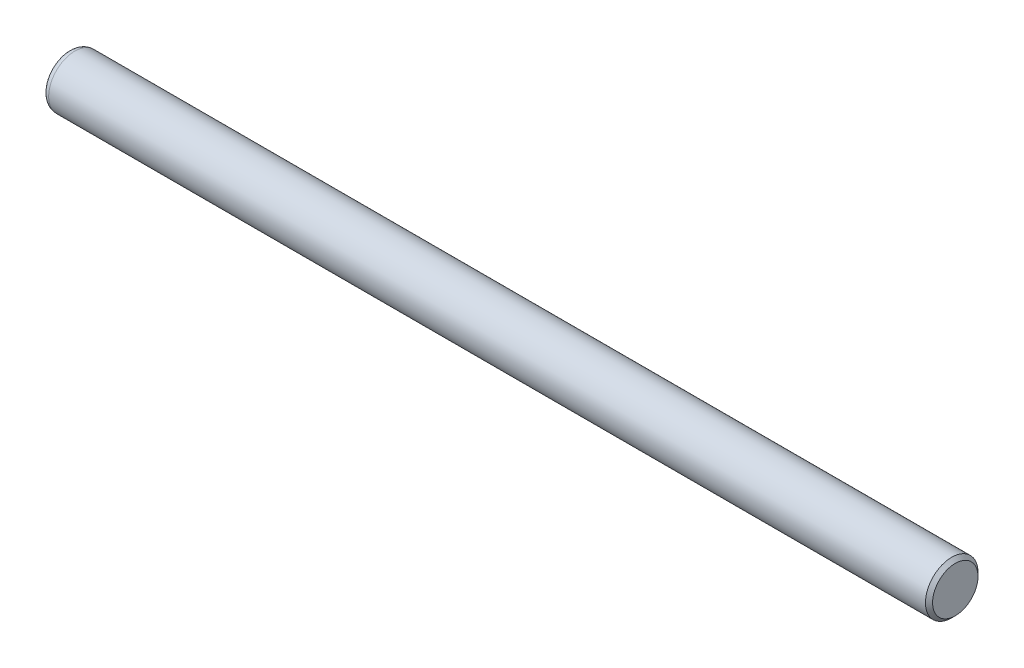
ISO-10303-21;
HEADER;
FILE_DESCRIPTION(('STEP AP214'),'2;1');
FILE_NAME('part.step','',(''),(''),'','','');
FILE_SCHEMA(('AUTOMOTIVE_DESIGN { 1 0 10303 214 1 1 1 1 }'));
ENDSEC;
DATA;
#1=APPLICATION_CONTEXT('core data for automotive mechanical design processes');
#2=APPLICATION_PROTOCOL_DEFINITION('international standard','automotive_design',2000,#1);
#3=PRODUCT_CONTEXT('',#1,'mechanical');
#4=PRODUCT('Part','Part','',(#3));
#5=PRODUCT_RELATED_PRODUCT_CATEGORY('part','',(#4));
#6=PRODUCT_DEFINITION_FORMATION('','',#4);
#7=PRODUCT_DEFINITION_CONTEXT('part definition',#1,'design');
#8=PRODUCT_DEFINITION('design','',#6,#7);
#9=PRODUCT_DEFINITION_SHAPE('','',#8);
#10=(LENGTH_UNIT() NAMED_UNIT(*) SI_UNIT(.MILLI.,.METRE.));
#11=(NAMED_UNIT(*) PLANE_ANGLE_UNIT() SI_UNIT($,.RADIAN.));
#12=(NAMED_UNIT(*) SI_UNIT($,.STERADIAN.) SOLID_ANGLE_UNIT());
#13=UNCERTAINTY_MEASURE_WITH_UNIT(LENGTH_MEASURE(1.E-05),#10,'distance_accuracy_value','');
#14=(GEOMETRIC_REPRESENTATION_CONTEXT(3) GLOBAL_UNCERTAINTY_ASSIGNED_CONTEXT((#13)) GLOBAL_UNIT_ASSIGNED_CONTEXT((#10,
#11,#12)) REPRESENTATION_CONTEXT('',''));
#15=CARTESIAN_POINT('',(0.,0.,0.));
#16=DIRECTION('',(0.,0.,1.));
#17=DIRECTION('',(1.,0.,0.));
#18=AXIS2_PLACEMENT_3D('',#15,#16,#17);
#19=CARTESIAN_POINT('',(0.,0.,0.));
#20=DIRECTION('',(1.,0.,0.));
#21=DIRECTION('',(0.,0.,-1.));
#22=AXIS2_PLACEMENT_3D('',#19,#20,#21);
#23=CYLINDRICAL_SURFACE('',#22,4.);
#24=CARTESIAN_POINT('',(866.,0.,0.));
#25=DIRECTION('',(1.,0.,0.));
#26=DIRECTION('',(0.,0.,-1.));
#27=AXIS2_PLACEMENT_3D('',#24,#25,#26);
#28=CIRCLE('',#27,4.);
#29=CARTESIAN_POINT('',(866.,0.,-4.));
#30=VERTEX_POINT('',#29);
#31=EDGE_CURVE('E10',#30,#30,#28,.T.);
#32=ORIENTED_EDGE('',*,*,#31,.T.);
#33=EDGE_LOOP('',(#32));
#34=FACE_BOUND('',#33,.T.);
#35=CARTESIAN_POINT('',(999.45875,0.,0.));
#36=DIRECTION('',(1.,0.,0.));
#37=DIRECTION('',(0.,0.,-1.));
#38=AXIS2_PLACEMENT_3D('',#35,#36,#37);
#39=CIRCLE('',#38,4.);
#40=CARTESIAN_POINT('',(999.45875,0.,-4.));
#41=VERTEX_POINT('',#40);
#42=EDGE_CURVE('E58',#41,#41,#39,.T.);
#43=ORIENTED_EDGE('',*,*,#42,.F.);
#44=EDGE_LOOP('',(#43));
#45=FACE_BOUND('',#44,.T.);
#46=ADVANCED_FACE('F47',(#34,#45),#23,.T.);
#47=CARTESIAN_POINT('',(1000.,0.,0.));
#48=DIRECTION('',(-1.,0.,0.));
#49=DIRECTION('',(0.,0.,1.));
#50=AXIS2_PLACEMENT_3D('',#47,#48,#49);
#51=CONICAL_SURFACE('',#50,3.4587500000002,0.785398163397422);
#52=ORIENTED_EDGE('',*,*,#42,.T.);
#53=EDGE_LOOP('',(#52));
#54=FACE_BOUND('',#53,.T.);
#55=CARTESIAN_POINT('',(1000.,0.,0.));
#56=DIRECTION('',(1.,0.,0.));
#57=DIRECTION('',(0.,0.,-1.));
#58=AXIS2_PLACEMENT_3D('',#55,#56,#57);
#59=CIRCLE('',#58,3.4587500000002);
#60=CARTESIAN_POINT('',(1000.,0.,-3.4587500000002));
#61=VERTEX_POINT('',#60);
#62=EDGE_CURVE('E62',#61,#61,#59,.T.);
#63=ORIENTED_EDGE('',*,*,#62,.F.);
#64=EDGE_LOOP('',(#63));
#65=FACE_BOUND('',#64,.T.);
#66=ADVANCED_FACE('F70',(#54,#65),#51,.T.);
#67=CARTESIAN_POINT('',(1000.,0.,0.));
#68=DIRECTION('',(1.,0.,0.));
#69=DIRECTION('',(0.,0.,-1.));
#70=AXIS2_PLACEMENT_3D('',#67,#68,#69);
#71=PLANE('',#70);
#72=ORIENTED_EDGE('',*,*,#62,.T.);
#73=EDGE_LOOP('',(#72));
#74=FACE_BOUND('',#73,.T.);
#75=ADVANCED_FACE('F68',(#74),#71,.T.);
#76=CARTESIAN_POINT('',(865.,9.,-4.));
#77=DIRECTION('',(1.,0.,0.));
#78=DIRECTION('',(0.,0.,-1.));
#79=AXIS2_PLACEMENT_3D('',#76,#77,#78);
#80=PLANE('',#79);
#81=CARTESIAN_POINT('',(865.,0.,0.));
#82=DIRECTION('',(1.,0.,0.));
#83=DIRECTION('',(0.,0.,-1.));
#84=AXIS2_PLACEMENT_3D('',#81,#82,#83);
#85=CIRCLE('',#84,3.);
#86=CARTESIAN_POINT('',(865.,0.,-3.));
#87=VERTEX_POINT('',#86);
#88=EDGE_CURVE('E54',#87,#87,#85,.F.);
#89=ORIENTED_EDGE('',*,*,#88,.T.);
#90=EDGE_LOOP('',(#89));
#91=FACE_BOUND('',#90,.T.);
#92=ADVANCED_FACE('F77',(#91),#80,.F.);
#93=CARTESIAN_POINT('',(866.,0.,0.));
#94=DIRECTION('',(1.,0.,0.));
#95=DIRECTION('',(0.,0.,-1.));
#96=AXIS2_PLACEMENT_3D('',#93,#94,#95);
#97=TOROIDAL_SURFACE('',#96,3.,1.);
#98=ORIENTED_EDGE('',*,*,#31,.F.);
#99=EDGE_LOOP('',(#98));
#100=FACE_BOUND('',#99,.T.);
#101=ORIENTED_EDGE('',*,*,#88,.F.);
#102=EDGE_LOOP('',(#101));
#103=FACE_BOUND('',#102,.T.);
#104=ADVANCED_FACE('F49',(#100,#103),#97,.T.);
#105=CLOSED_SHELL('',(#46,#66,#75,#92,#104));
#106=MANIFOLD_SOLID_BREP('B2',#105);
#107=ADVANCED_BREP_SHAPE_REPRESENTATION('',(#18,#106),#14);
#108=SHAPE_DEFINITION_REPRESENTATION(#9,#107);
ENDSEC;
END-ISO-10303-21;
